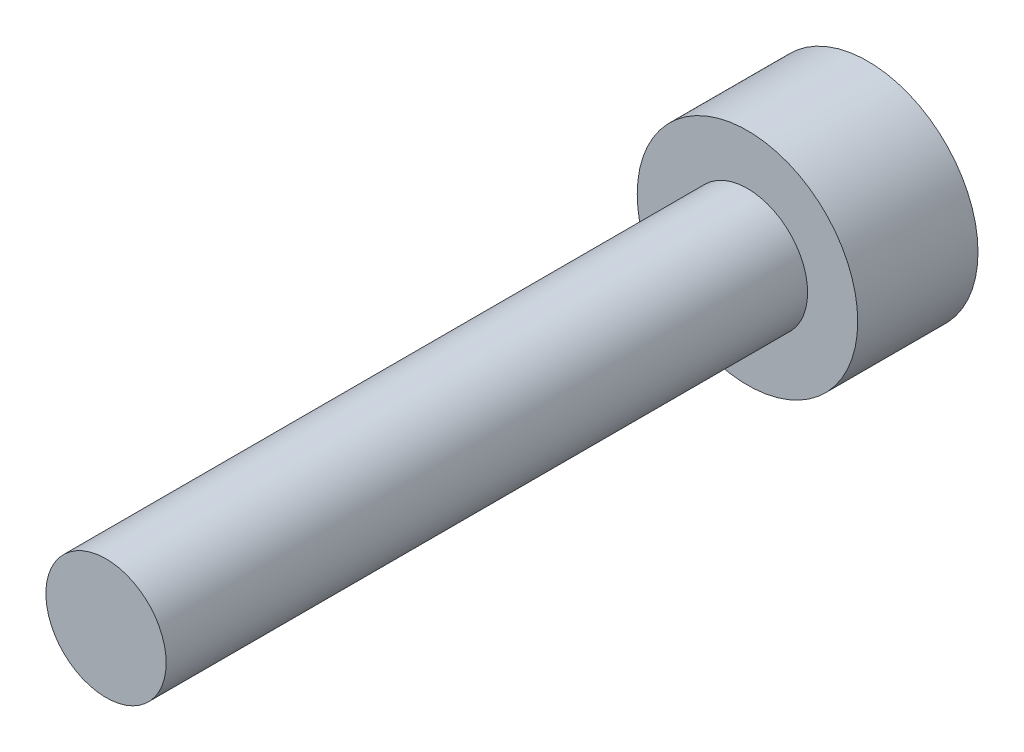
ISO-10303-21;
HEADER;
FILE_DESCRIPTION(('STEP AP214'),'2;1');
FILE_NAME('part.step','',(''),(''),'','','');
FILE_SCHEMA(('AUTOMOTIVE_DESIGN { 1 0 10303 214 1 1 1 1 }'));
ENDSEC;
DATA;
#1=APPLICATION_CONTEXT('core data for automotive mechanical design processes');
#2=APPLICATION_PROTOCOL_DEFINITION('international standard','automotive_design',2000,#1);
#3=PRODUCT_CONTEXT('',#1,'mechanical');
#4=PRODUCT('Part','Part','',(#3));
#5=PRODUCT_RELATED_PRODUCT_CATEGORY('part','',(#4));
#6=PRODUCT_DEFINITION_FORMATION('','',#4);
#7=PRODUCT_DEFINITION_CONTEXT('part definition',#1,'design');
#8=PRODUCT_DEFINITION('design','',#6,#7);
#9=PRODUCT_DEFINITION_SHAPE('','',#8);
#10=(LENGTH_UNIT() NAMED_UNIT(*) SI_UNIT(.MILLI.,.METRE.));
#11=(NAMED_UNIT(*) PLANE_ANGLE_UNIT() SI_UNIT($,.RADIAN.));
#12=(NAMED_UNIT(*) SI_UNIT($,.STERADIAN.) SOLID_ANGLE_UNIT());
#13=UNCERTAINTY_MEASURE_WITH_UNIT(LENGTH_MEASURE(1.E-05),#10,'distance_accuracy_value','');
#14=(GEOMETRIC_REPRESENTATION_CONTEXT(3) GLOBAL_UNCERTAINTY_ASSIGNED_CONTEXT((#13)) GLOBAL_UNIT_ASSIGNED_CONTEXT((#10,
#11,#12)) REPRESENTATION_CONTEXT('',''));
#15=CARTESIAN_POINT('',(0.,0.,0.));
#16=DIRECTION('',(0.,0.,1.));
#17=DIRECTION('',(1.,0.,0.));
#18=AXIS2_PLACEMENT_3D('',#15,#16,#17);
#19=CARTESIAN_POINT('',(0.,0.,16.));
#20=DIRECTION('',(0.,0.,-1.));
#21=DIRECTION('',(-1.,0.,0.));
#22=AXIS2_PLACEMENT_3D('',#19,#20,#21);
#23=CYLINDRICAL_SURFACE('',#22,1.5);
#24=CARTESIAN_POINT('',(0.,0.,16.));
#25=DIRECTION('',(0.,0.,1.));
#26=DIRECTION('',(1.,0.,0.));
#27=AXIS2_PLACEMENT_3D('',#24,#25,#26);
#28=CIRCLE('',#27,1.5);
#29=CARTESIAN_POINT('',(1.5,0.,16.));
#30=VERTEX_POINT('',#29);
#31=EDGE_CURVE('E11',#30,#30,#28,.T.);
#32=ORIENTED_EDGE('',*,*,#31,.F.);
#33=EDGE_LOOP('',(#32));
#34=FACE_BOUND('',#33,.T.);
#35=CARTESIAN_POINT('',(0.,0.,0.));
#36=DIRECTION('',(0.,0.,1.));
#37=DIRECTION('',(1.,0.,0.));
#38=AXIS2_PLACEMENT_3D('',#35,#36,#37);
#39=CIRCLE('',#38,1.5);
#40=CARTESIAN_POINT('',(1.5,0.,0.));
#41=VERTEX_POINT('',#40);
#42=EDGE_CURVE('E45',#41,#41,#39,.T.);
#43=ORIENTED_EDGE('',*,*,#42,.T.);
#44=EDGE_LOOP('',(#43));
#45=FACE_BOUND('',#44,.T.);
#46=ADVANCED_FACE('F39',(#34,#45),#23,.T.);
#47=CARTESIAN_POINT('',(0.,0.,16.));
#48=DIRECTION('',(0.,0.,1.));
#49=DIRECTION('',(1.,0.,0.));
#50=AXIS2_PLACEMENT_3D('',#47,#48,#49);
#51=PLANE('',#50);
#52=ORIENTED_EDGE('',*,*,#31,.T.);
#53=EDGE_LOOP('',(#52));
#54=FACE_BOUND('',#53,.T.);
#55=ADVANCED_FACE('F160',(#54),#51,.T.);
#56=CARTESIAN_POINT('',(0.,0.,-3.));
#57=DIRECTION('',(0.,0.,1.));
#58=DIRECTION('',(1.,0.,0.));
#59=AXIS2_PLACEMENT_3D('',#56,#57,#58);
#60=CYLINDRICAL_SURFACE('',#59,2.75);
#61=CARTESIAN_POINT('',(0.,0.,-3.));
#62=DIRECTION('',(0.,0.,1.));
#63=DIRECTION('',(1.,0.,0.));
#64=AXIS2_PLACEMENT_3D('',#61,#62,#63);
#65=CIRCLE('',#64,2.75);
#66=CARTESIAN_POINT('',(2.75,0.,-3.));
#67=VERTEX_POINT('',#66);
#68=EDGE_CURVE('E148',#67,#67,#65,.T.);
#69=ORIENTED_EDGE('',*,*,#68,.T.);
#70=EDGE_LOOP('',(#69));
#71=FACE_BOUND('',#70,.T.);
#72=CARTESIAN_POINT('',(0.,0.,0.));
#73=DIRECTION('',(0.,0.,1.));
#74=DIRECTION('',(1.,0.,0.));
#75=AXIS2_PLACEMENT_3D('',#72,#73,#74);
#76=CIRCLE('',#75,2.75);
#77=CARTESIAN_POINT('',(2.75,0.,0.));
#78=VERTEX_POINT('',#77);
#79=EDGE_CURVE('E139',#78,#78,#76,.T.);
#80=ORIENTED_EDGE('',*,*,#79,.F.);
#81=EDGE_LOOP('',(#80));
#82=FACE_BOUND('',#81,.T.);
#83=ADVANCED_FACE('F152',(#71,#82),#60,.T.);
#84=CARTESIAN_POINT('',(0.,0.,-3.));
#85=DIRECTION('',(0.,0.,1.));
#86=DIRECTION('',(1.,0.,0.));
#87=AXIS2_PLACEMENT_3D('',#84,#85,#86);
#88=PLANE('',#87);
#89=DIRECTION('',(0.5,0.866025403784439,0.));
#90=VECTOR('',#89,1.);
#91=CARTESIAN_POINT('',(-1.44337567297406,0.,-3.));
#92=LINE('',#91,#90);
#93=CARTESIAN_POINT('',(-1.44337567297406,0.,-3.));
#94=VERTEX_POINT('',#93);
#95=CARTESIAN_POINT('',(-0.721687836487032,1.25,-3.));
#96=VERTEX_POINT('',#95);
#97=EDGE_CURVE('E130',#94,#96,#92,.T.);
#98=ORIENTED_EDGE('',*,*,#97,.F.);
#99=DIRECTION('',(-0.5,0.866025403784439,0.));
#100=VECTOR('',#99,1.);
#101=CARTESIAN_POINT('',(-0.721687836487032,-1.25,-3.));
#102=LINE('',#101,#100);
#103=CARTESIAN_POINT('',(-0.721687836487032,-1.25,-3.));
#104=VERTEX_POINT('',#103);
#105=EDGE_CURVE('E52',#104,#94,#102,.T.);
#106=ORIENTED_EDGE('',*,*,#105,.F.);
#107=DIRECTION('',(-1.,0.,0.));
#108=VECTOR('',#107,1.);
#109=CARTESIAN_POINT('',(0.721687836487033,-1.25,-3.));
#110=LINE('',#109,#108);
#111=CARTESIAN_POINT('',(0.721687836487033,-1.25,-3.));
#112=VERTEX_POINT('',#111);
#113=EDGE_CURVE('E136',#112,#104,#110,.T.);
#114=ORIENTED_EDGE('',*,*,#113,.F.);
#115=DIRECTION('',(-0.5,-0.866025403784439,0.));
#116=VECTOR('',#115,1.);
#117=CARTESIAN_POINT('',(1.44337567297406,0.,-3.));
#118=LINE('',#117,#116);
#119=CARTESIAN_POINT('',(1.44337567297406,0.,-3.));
#120=VERTEX_POINT('',#119);
#121=EDGE_CURVE('E135',#120,#112,#118,.T.);
#122=ORIENTED_EDGE('',*,*,#121,.F.);
#123=DIRECTION('',(0.5,-0.866025403784439,0.));
#124=VECTOR('',#123,1.);
#125=CARTESIAN_POINT('',(0.721687836487032,1.25,-3.));
#126=LINE('',#125,#124);
#127=CARTESIAN_POINT('',(0.721687836487032,1.25,-3.));
#128=VERTEX_POINT('',#127);
#129=EDGE_CURVE('E101',#128,#120,#126,.T.);
#130=ORIENTED_EDGE('',*,*,#129,.F.);
#131=DIRECTION('',(1.,0.,0.));
#132=VECTOR('',#131,1.);
#133=CARTESIAN_POINT('',(-0.721687836487032,1.25,-3.));
#134=LINE('',#133,#132);
#135=EDGE_CURVE('E128',#96,#128,#134,.T.);
#136=ORIENTED_EDGE('',*,*,#135,.F.);
#137=EDGE_LOOP('',(#98,#106,#114,#122,#130,#136));
#138=FACE_BOUND('',#137,.T.);
#139=ORIENTED_EDGE('',*,*,#68,.F.);
#140=EDGE_LOOP('',(#139));
#141=FACE_BOUND('',#140,.T.);
#142=ADVANCED_FACE('F156',(#138,#141),#88,.F.);
#143=CARTESIAN_POINT('',(0.,0.,0.));
#144=DIRECTION('',(0.,0.,1.));
#145=DIRECTION('',(1.,0.,0.));
#146=AXIS2_PLACEMENT_3D('',#143,#144,#145);
#147=PLANE('',#146);
#148=ORIENTED_EDGE('',*,*,#42,.F.);
#149=EDGE_LOOP('',(#148));
#150=FACE_BOUND('',#149,.T.);
#151=ORIENTED_EDGE('',*,*,#79,.T.);
#152=EDGE_LOOP('',(#151));
#153=FACE_BOUND('',#152,.T.);
#154=ADVANCED_FACE('F155',(#150,#153),#147,.T.);
#155=CARTESIAN_POINT('',(-0.721687836487032,-1.25,-1.7));
#156=DIRECTION('',(-0.866025403784439,-0.5,0.));
#157=DIRECTION('',(0.5,-0.866025403784439,0.));
#158=AXIS2_PLACEMENT_3D('',#155,#156,#157);
#159=PLANE('',#158);
#160=ORIENTED_EDGE('',*,*,#105,.T.);
#161=DIRECTION('',(0.,0.,-1.));
#162=VECTOR('',#161,1.);
#163=CARTESIAN_POINT('',(-1.44337567297406,0.,-1.7));
#164=LINE('',#163,#162);
#165=CARTESIAN_POINT('',(-1.44337567297406,0.,-1.7));
#166=VERTEX_POINT('',#165);
#167=EDGE_CURVE('E82',#166,#94,#164,.T.);
#168=ORIENTED_EDGE('',*,*,#167,.F.);
#169=DIRECTION('',(-0.5,0.866025403784439,0.));
#170=VECTOR('',#169,1.);
#171=CARTESIAN_POINT('',(-0.721687836487032,-1.25,-1.7));
#172=LINE('',#171,#170);
#173=CARTESIAN_POINT('',(-0.721687836487032,-1.25,-1.7));
#174=VERTEX_POINT('',#173);
#175=EDGE_CURVE('E137',#174,#166,#172,.T.);
#176=ORIENTED_EDGE('',*,*,#175,.F.);
#177=DIRECTION('',(0.,0.,-1.));
#178=VECTOR('',#177,1.);
#179=CARTESIAN_POINT('',(-0.721687836487032,-1.25,-1.7));
#180=LINE('',#179,#178);
#181=EDGE_CURVE('E63',#174,#104,#180,.T.);
#182=ORIENTED_EDGE('',*,*,#181,.T.);
#183=EDGE_LOOP('',(#160,#168,#176,#182));
#184=FACE_BOUND('',#183,.T.);
#185=ADVANCED_FACE('F177',(#184),#159,.F.);
#186=CARTESIAN_POINT('',(0.721687836487033,-1.25,-1.7));
#187=DIRECTION('',(0.,-1.,0.));
#188=DIRECTION('',(1.,0.,0.));
#189=AXIS2_PLACEMENT_3D('',#186,#187,#188);
#190=PLANE('',#189);
#191=ORIENTED_EDGE('',*,*,#113,.T.);
#192=ORIENTED_EDGE('',*,*,#181,.F.);
#193=DIRECTION('',(-1.,0.,0.));
#194=VECTOR('',#193,1.);
#195=CARTESIAN_POINT('',(0.721687836487033,-1.25,-1.7));
#196=LINE('',#195,#194);
#197=CARTESIAN_POINT('',(0.721687836487033,-1.25,-1.7));
#198=VERTEX_POINT('',#197);
#199=EDGE_CURVE('E114',#198,#174,#196,.T.);
#200=ORIENTED_EDGE('',*,*,#199,.F.);
#201=DIRECTION('',(0.,0.,-1.));
#202=VECTOR('',#201,1.);
#203=CARTESIAN_POINT('',(0.721687836487033,-1.25,-1.7));
#204=LINE('',#203,#202);
#205=EDGE_CURVE('E104',#198,#112,#204,.T.);
#206=ORIENTED_EDGE('',*,*,#205,.T.);
#207=EDGE_LOOP('',(#191,#192,#200,#206));
#208=FACE_BOUND('',#207,.T.);
#209=ADVANCED_FACE('F185',(#208),#190,.F.);
#210=CARTESIAN_POINT('',(1.44337567297406,0.,-1.7));
#211=DIRECTION('',(0.866025403784439,-0.5,0.));
#212=DIRECTION('',(0.5,0.866025403784439,0.));
#213=AXIS2_PLACEMENT_3D('',#210,#211,#212);
#214=PLANE('',#213);
#215=ORIENTED_EDGE('',*,*,#121,.T.);
#216=ORIENTED_EDGE('',*,*,#205,.F.);
#217=DIRECTION('',(-0.5,-0.866025403784439,0.));
#218=VECTOR('',#217,1.);
#219=CARTESIAN_POINT('',(1.44337567297406,0.,-1.7));
#220=LINE('',#219,#218);
#221=CARTESIAN_POINT('',(1.44337567297406,0.,-1.7));
#222=VERTEX_POINT('',#221);
#223=EDGE_CURVE('E108',#222,#198,#220,.T.);
#224=ORIENTED_EDGE('',*,*,#223,.F.);
#225=DIRECTION('',(0.,0.,-1.));
#226=VECTOR('',#225,1.);
#227=CARTESIAN_POINT('',(1.44337567297406,0.,-1.7));
#228=LINE('',#227,#226);
#229=EDGE_CURVE('E94',#222,#120,#228,.T.);
#230=ORIENTED_EDGE('',*,*,#229,.T.);
#231=EDGE_LOOP('',(#215,#216,#224,#230));
#232=FACE_BOUND('',#231,.T.);
#233=ADVANCED_FACE('F109',(#232),#214,.F.);
#234=CARTESIAN_POINT('',(0.721687836487032,1.25,-1.7));
#235=DIRECTION('',(0.866025403784439,0.5,0.));
#236=DIRECTION('',(-0.5,0.866025403784439,0.));
#237=AXIS2_PLACEMENT_3D('',#234,#235,#236);
#238=PLANE('',#237);
#239=ORIENTED_EDGE('',*,*,#129,.T.);
#240=ORIENTED_EDGE('',*,*,#229,.F.);
#241=DIRECTION('',(0.5,-0.866025403784439,0.));
#242=VECTOR('',#241,1.);
#243=CARTESIAN_POINT('',(0.721687836487032,1.25,-1.7));
#244=LINE('',#243,#242);
#245=CARTESIAN_POINT('',(0.721687836487032,1.25,-1.7));
#246=VERTEX_POINT('',#245);
#247=EDGE_CURVE('E98',#246,#222,#244,.T.);
#248=ORIENTED_EDGE('',*,*,#247,.F.);
#249=DIRECTION('',(0.,0.,-1.));
#250=VECTOR('',#249,1.);
#251=CARTESIAN_POINT('',(0.721687836487032,1.25,-1.7));
#252=LINE('',#251,#250);
#253=EDGE_CURVE('E106',#246,#128,#252,.T.);
#254=ORIENTED_EDGE('',*,*,#253,.T.);
#255=EDGE_LOOP('',(#239,#240,#248,#254));
#256=FACE_BOUND('',#255,.T.);
#257=ADVANCED_FACE('F96',(#256),#238,.F.);
#258=CARTESIAN_POINT('',(-0.721687836487032,1.25,-1.7));
#259=DIRECTION('',(0.,1.,0.));
#260=DIRECTION('',(-1.,0.,0.));
#261=AXIS2_PLACEMENT_3D('',#258,#259,#260);
#262=PLANE('',#261);
#263=ORIENTED_EDGE('',*,*,#135,.T.);
#264=ORIENTED_EDGE('',*,*,#253,.F.);
#265=DIRECTION('',(1.,0.,0.));
#266=VECTOR('',#265,1.);
#267=CARTESIAN_POINT('',(-0.721687836487032,1.25,-1.7));
#268=LINE('',#267,#266);
#269=CARTESIAN_POINT('',(-0.721687836487032,1.25,-1.7));
#270=VERTEX_POINT('',#269);
#271=EDGE_CURVE('E120',#270,#246,#268,.T.);
#272=ORIENTED_EDGE('',*,*,#271,.F.);
#273=DIRECTION('',(0.,0.,-1.));
#274=VECTOR('',#273,1.);
#275=CARTESIAN_POINT('',(-0.721687836487032,1.25,-1.7));
#276=LINE('',#275,#274);
#277=EDGE_CURVE('E141',#270,#96,#276,.T.);
#278=ORIENTED_EDGE('',*,*,#277,.T.);
#279=EDGE_LOOP('',(#263,#264,#272,#278));
#280=FACE_BOUND('',#279,.T.);
#281=ADVANCED_FACE('F187',(#280),#262,.F.);
#282=CARTESIAN_POINT('',(-1.44337567297406,0.,-1.7));
#283=DIRECTION('',(-0.866025403784439,0.5,0.));
#284=DIRECTION('',(-0.5,-0.866025403784439,0.));
#285=AXIS2_PLACEMENT_3D('',#282,#283,#284);
#286=PLANE('',#285);
#287=ORIENTED_EDGE('',*,*,#97,.T.);
#288=ORIENTED_EDGE('',*,*,#277,.F.);
#289=DIRECTION('',(0.5,0.866025403784439,0.));
#290=VECTOR('',#289,1.);
#291=CARTESIAN_POINT('',(-1.44337567297406,0.,-1.7));
#292=LINE('',#291,#290);
#293=EDGE_CURVE('E121',#166,#270,#292,.T.);
#294=ORIENTED_EDGE('',*,*,#293,.F.);
#295=ORIENTED_EDGE('',*,*,#167,.T.);
#296=EDGE_LOOP('',(#287,#288,#294,#295));
#297=FACE_BOUND('',#296,.T.);
#298=ADVANCED_FACE('F183',(#297),#286,.F.);
#299=CARTESIAN_POINT('',(0.,0.,-1.7));
#300=DIRECTION('',(0.,0.,-1.));
#301=DIRECTION('',(-1.,0.,0.));
#302=AXIS2_PLACEMENT_3D('',#299,#300,#301);
#303=PLANE('',#302);
#304=ORIENTED_EDGE('',*,*,#175,.T.);
#305=ORIENTED_EDGE('',*,*,#293,.T.);
#306=ORIENTED_EDGE('',*,*,#271,.T.);
#307=ORIENTED_EDGE('',*,*,#247,.T.);
#308=ORIENTED_EDGE('',*,*,#223,.T.);
#309=ORIENTED_EDGE('',*,*,#199,.T.);
#310=EDGE_LOOP('',(#304,#305,#306,#307,#308,#309));
#311=FACE_BOUND('',#310,.T.);
#312=ADVANCED_FACE('F118',(#311),#303,.T.);
#313=CLOSED_SHELL('',(#46,#55,#83,#142,#154,#185,#209,#233,#257,#281,#298,#312));
#314=MANIFOLD_SOLID_BREP('B2',#313);
#315=ADVANCED_BREP_SHAPE_REPRESENTATION('',(#18,#314),#14);
#316=SHAPE_DEFINITION_REPRESENTATION(#9,#315);
ENDSEC;
END-ISO-10303-21;
